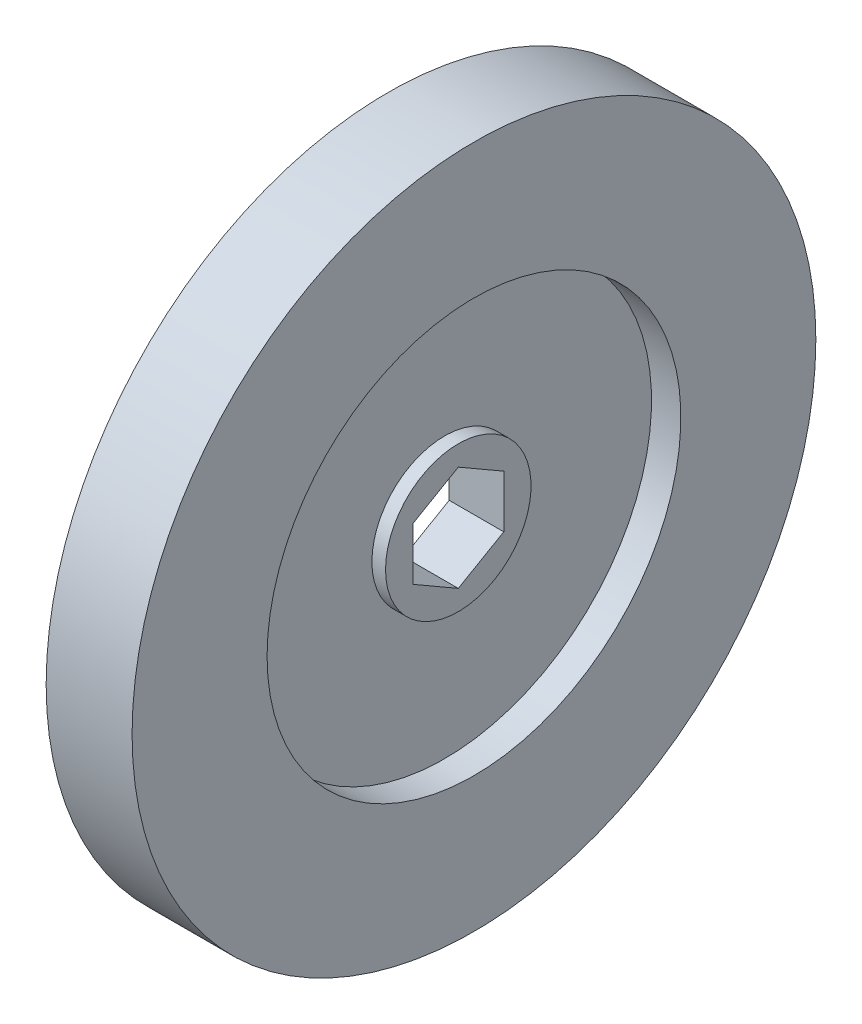
ISO-10303-21;
HEADER;
FILE_DESCRIPTION(('STEP AP214'),'2;1');
FILE_NAME('part.step','',(''),(''),'','','');
FILE_SCHEMA(('AUTOMOTIVE_DESIGN { 1 0 10303 214 1 1 1 1 }'));
ENDSEC;
DATA;
#1=APPLICATION_CONTEXT('core data for automotive mechanical design processes');
#2=APPLICATION_PROTOCOL_DEFINITION('international standard','automotive_design',2000,#1);
#3=PRODUCT_CONTEXT('',#1,'mechanical');
#4=PRODUCT('Part','Part','',(#3));
#5=PRODUCT_RELATED_PRODUCT_CATEGORY('part','',(#4));
#6=PRODUCT_DEFINITION_FORMATION('','',#4);
#7=PRODUCT_DEFINITION_CONTEXT('part definition',#1,'design');
#8=PRODUCT_DEFINITION('design','',#6,#7);
#9=PRODUCT_DEFINITION_SHAPE('','',#8);
#10=(LENGTH_UNIT() NAMED_UNIT(*) SI_UNIT(.MILLI.,.METRE.));
#11=(NAMED_UNIT(*) PLANE_ANGLE_UNIT() SI_UNIT($,.RADIAN.));
#12=(NAMED_UNIT(*) SI_UNIT($,.STERADIAN.) SOLID_ANGLE_UNIT());
#13=UNCERTAINTY_MEASURE_WITH_UNIT(LENGTH_MEASURE(1.E-05),#10,'distance_accuracy_value','');
#14=(GEOMETRIC_REPRESENTATION_CONTEXT(3) GLOBAL_UNCERTAINTY_ASSIGNED_CONTEXT((#13)) GLOBAL_UNIT_ASSIGNED_CONTEXT((#10,
#11,#12)) REPRESENTATION_CONTEXT('',''));
#15=CARTESIAN_POINT('',(0.,0.,0.));
#16=DIRECTION('',(0.,0.,1.));
#17=DIRECTION('',(1.,0.,0.));
#18=AXIS2_PLACEMENT_3D('',#15,#16,#17);
#19=CARTESIAN_POINT('',(6.,47.7464829275686,0.));
#20=DIRECTION('',(-1.,0.,0.));
#21=DIRECTION('',(0.,0.,1.));
#22=AXIS2_PLACEMENT_3D('',#19,#20,#21);
#23=PLANE('',#22);
#24=CARTESIAN_POINT('',(6.,0.,0.));
#25=DIRECTION('',(-1.,0.,0.));
#26=DIRECTION('',(0.,0.,1.));
#27=AXIS2_PLACEMENT_3D('',#24,#25,#26);
#28=CIRCLE('',#27,47.7464829275686);
#29=CARTESIAN_POINT('',(6.,0.,47.7464829275686));
#30=VERTEX_POINT('',#29);
#31=EDGE_CURVE('E118',#30,#30,#28,.T.);
#32=ORIENTED_EDGE('',*,*,#31,.F.);
#33=EDGE_LOOP('',(#32));
#34=FACE_BOUND('',#33,.T.);
#35=CARTESIAN_POINT('',(6.,0.,0.));
#36=DIRECTION('',(-1.,0.,0.));
#37=DIRECTION('',(0.,0.,1.));
#38=AXIS2_PLACEMENT_3D('',#35,#36,#37);
#39=CIRCLE('',#38,28.8925);
#40=CARTESIAN_POINT('',(6.,0.,28.8925));
#41=VERTEX_POINT('',#40);
#42=EDGE_CURVE('E151',#41,#41,#39,.T.);
#43=ORIENTED_EDGE('',*,*,#42,.T.);
#44=EDGE_LOOP('',(#43));
#45=FACE_BOUND('',#44,.T.);
#46=ADVANCED_FACE('F33',(#34,#45),#23,.F.);
#47=CARTESIAN_POINT('',(-12.5660346603092,0.,0.));
#48=DIRECTION('',(-1.,0.,0.));
#49=DIRECTION('',(0.,0.,1.));
#50=AXIS2_PLACEMENT_3D('',#47,#48,#49);
#51=CYLINDRICAL_SURFACE('',#50,28.8925);
#52=ORIENTED_EDGE('',*,*,#42,.F.);
#53=EDGE_LOOP('',(#52));
#54=FACE_BOUND('',#53,.T.);
#55=CARTESIAN_POINT('',(1.905,0.,0.));
#56=DIRECTION('',(-1.,0.,0.));
#57=DIRECTION('',(0.,0.,1.));
#58=AXIS2_PLACEMENT_3D('',#55,#56,#57);
#59=CIRCLE('',#58,28.8925);
#60=CARTESIAN_POINT('',(1.905,0.,28.8925));
#61=VERTEX_POINT('',#60);
#62=EDGE_CURVE('E148',#61,#61,#59,.T.);
#63=ORIENTED_EDGE('',*,*,#62,.T.);
#64=EDGE_LOOP('',(#63));
#65=FACE_BOUND('',#64,.T.);
#66=ADVANCED_FACE('F190',(#54,#65),#51,.F.);
#67=CARTESIAN_POINT('',(1.905,28.8925,0.));
#68=DIRECTION('',(-1.,0.,0.));
#69=DIRECTION('',(0.,0.,1.));
#70=AXIS2_PLACEMENT_3D('',#67,#68,#69);
#71=PLANE('',#70);
#72=ORIENTED_EDGE('',*,*,#62,.F.);
#73=EDGE_LOOP('',(#72));
#74=FACE_BOUND('',#73,.T.);
#75=CARTESIAN_POINT('',(1.905,0.,0.));
#76=DIRECTION('',(-1.,0.,0.));
#77=DIRECTION('',(0.,0.,1.));
#78=AXIS2_PLACEMENT_3D('',#75,#76,#77);
#79=CIRCLE('',#78,10.16);
#80=CARTESIAN_POINT('',(1.905,0.,10.16));
#81=VERTEX_POINT('',#80);
#82=EDGE_CURVE('E145',#81,#81,#79,.T.);
#83=ORIENTED_EDGE('',*,*,#82,.T.);
#84=EDGE_LOOP('',(#83));
#85=FACE_BOUND('',#84,.T.);
#86=ADVANCED_FACE('F195',(#74,#85),#71,.F.);
#87=CARTESIAN_POINT('',(-12.5660346603092,0.,0.));
#88=DIRECTION('',(-1.,0.,0.));
#89=DIRECTION('',(0.,0.,1.));
#90=AXIS2_PLACEMENT_3D('',#87,#88,#89);
#91=CYLINDRICAL_SURFACE('',#90,10.16);
#92=ORIENTED_EDGE('',*,*,#82,.F.);
#93=EDGE_LOOP('',(#92));
#94=FACE_BOUND('',#93,.T.);
#95=CARTESIAN_POINT('',(3.81,0.,0.));
#96=DIRECTION('',(-1.,0.,0.));
#97=DIRECTION('',(0.,0.,1.));
#98=AXIS2_PLACEMENT_3D('',#95,#96,#97);
#99=CIRCLE('',#98,10.16);
#100=CARTESIAN_POINT('',(3.81,0.,10.16));
#101=VERTEX_POINT('',#100);
#102=EDGE_CURVE('E142',#101,#101,#99,.T.);
#103=ORIENTED_EDGE('',*,*,#102,.T.);
#104=EDGE_LOOP('',(#103));
#105=FACE_BOUND('',#104,.T.);
#106=ADVANCED_FACE('F205',(#94,#105),#91,.T.);
#107=CARTESIAN_POINT('',(3.81,10.16,0.));
#108=DIRECTION('',(-1.,0.,0.));
#109=DIRECTION('',(0.,0.,1.));
#110=AXIS2_PLACEMENT_3D('',#107,#108,#109);
#111=PLANE('',#110);
#112=DIRECTION('',(0.,-0.5,0.866025403784439));
#113=VECTOR('',#112,1.);
#114=CARTESIAN_POINT('',(3.81,7.33234841870825,0.));
#115=LINE('',#114,#113);
#116=CARTESIAN_POINT('',(3.81,7.33234841870825,0.));
#117=VERTEX_POINT('',#116);
#118=CARTESIAN_POINT('',(3.81,3.66617420935413,6.35));
#119=VERTEX_POINT('',#118);
#120=EDGE_CURVE('E97',#117,#119,#115,.T.);
#121=ORIENTED_EDGE('',*,*,#120,.F.);
#122=DIRECTION('',(0.,0.5,0.866025403784439));
#123=VECTOR('',#122,1.);
#124=CARTESIAN_POINT('',(3.81,3.66617420935412,-6.35));
#125=LINE('',#124,#123);
#126=CARTESIAN_POINT('',(3.81,3.66617420935412,-6.35));
#127=VERTEX_POINT('',#126);
#128=EDGE_CURVE('E47',#127,#117,#125,.T.);
#129=ORIENTED_EDGE('',*,*,#128,.F.);
#130=DIRECTION('',(0.,1.,0.));
#131=VECTOR('',#130,1.);
#132=CARTESIAN_POINT('',(3.81,-3.66617420935413,-6.35));
#133=LINE('',#132,#131);
#134=CARTESIAN_POINT('',(3.81,-3.66617420935413,-6.35));
#135=VERTEX_POINT('',#134);
#136=EDGE_CURVE('E113',#135,#127,#133,.T.);
#137=ORIENTED_EDGE('',*,*,#136,.F.);
#138=DIRECTION('',(0.,0.5,-0.866025403784439));
#139=VECTOR('',#138,1.);
#140=CARTESIAN_POINT('',(3.81,-7.33234841870825,0.));
#141=LINE('',#140,#139);
#142=CARTESIAN_POINT('',(3.81,-7.33234841870825,0.));
#143=VERTEX_POINT('',#142);
#144=EDGE_CURVE('E107',#143,#135,#141,.T.);
#145=ORIENTED_EDGE('',*,*,#144,.F.);
#146=DIRECTION('',(0.,-0.5,-0.866025403784439));
#147=VECTOR('',#146,1.);
#148=CARTESIAN_POINT('',(3.81,-3.66617420935413,6.35));
#149=LINE('',#148,#147);
#150=CARTESIAN_POINT('',(3.81,-3.66617420935413,6.35));
#151=VERTEX_POINT('',#150);
#152=EDGE_CURVE('E105',#151,#143,#149,.T.);
#153=ORIENTED_EDGE('',*,*,#152,.F.);
#154=DIRECTION('',(0.,-1.,0.));
#155=VECTOR('',#154,1.);
#156=CARTESIAN_POINT('',(3.81,3.66617420935413,6.35));
#157=LINE('',#156,#155);
#158=EDGE_CURVE('E88',#119,#151,#157,.T.);
#159=ORIENTED_EDGE('',*,*,#158,.F.);
#160=EDGE_LOOP('',(#121,#129,#137,#145,#153,#159));
#161=FACE_BOUND('',#160,.T.);
#162=ORIENTED_EDGE('',*,*,#102,.F.);
#163=EDGE_LOOP('',(#162));
#164=FACE_BOUND('',#163,.T.);
#165=ADVANCED_FACE('F101',(#161,#164),#111,.F.);
#166=CARTESIAN_POINT('',(-3.81,10.16,0.));
#167=DIRECTION('',(1.,0.,0.));
#168=DIRECTION('',(0.,0.,-1.));
#169=AXIS2_PLACEMENT_3D('',#166,#167,#168);
#170=PLANE('',#169);
#171=DIRECTION('',(0.,1.,0.));
#172=VECTOR('',#171,1.);
#173=CARTESIAN_POINT('',(-3.81,10.16,-6.35));
#174=LINE('',#173,#172);
#175=CARTESIAN_POINT('',(-3.81,-3.66617420935413,-6.35));
#176=VERTEX_POINT('',#175);
#177=CARTESIAN_POINT('',(-3.81,3.66617420935412,-6.35));
#178=VERTEX_POINT('',#177);
#179=EDGE_CURVE('E40',#176,#178,#174,.T.);
#180=ORIENTED_EDGE('',*,*,#179,.T.);
#181=DIRECTION('',(0.,0.5,0.866025403784439));
#182=VECTOR('',#181,1.);
#183=CARTESIAN_POINT('',(-3.81,8.03926131403118,1.22440905122495));
#184=LINE('',#183,#182);
#185=CARTESIAN_POINT('',(-3.81,7.33234841870825,0.));
#186=VERTEX_POINT('',#185);
#187=EDGE_CURVE('E11',#178,#186,#184,.T.);
#188=ORIENTED_EDGE('',*,*,#187,.T.);
#189=DIRECTION('',(0.,-0.5,0.866025403784439));
#190=VECTOR('',#189,1.);
#191=CARTESIAN_POINT('',(-3.81,8.03926131403118,-1.22440905122495));
#192=LINE('',#191,#190);
#193=CARTESIAN_POINT('',(-3.81,3.66617420935413,6.35));
#194=VERTEX_POINT('',#193);
#195=EDGE_CURVE('E154',#186,#194,#192,.T.);
#196=ORIENTED_EDGE('',*,*,#195,.T.);
#197=DIRECTION('',(0.,-1.,0.));
#198=VECTOR('',#197,1.);
#199=CARTESIAN_POINT('',(-3.81,10.16,6.35));
#200=LINE('',#199,#198);
#201=CARTESIAN_POINT('',(-3.81,-3.66617420935413,6.35));
#202=VERTEX_POINT('',#201);
#203=EDGE_CURVE('E91',#194,#202,#200,.T.);
#204=ORIENTED_EDGE('',*,*,#203,.T.);
#205=DIRECTION('',(0.,-0.5,-0.866025403784439));
#206=VECTOR('',#205,1.);
#207=CARTESIAN_POINT('',(-3.81,-2.95926131403119,7.57440905122495));
#208=LINE('',#207,#206);
#209=CARTESIAN_POINT('',(-3.81,-7.33234841870825,0.));
#210=VERTEX_POINT('',#209);
#211=EDGE_CURVE('E157',#202,#210,#208,.T.);
#212=ORIENTED_EDGE('',*,*,#211,.T.);
#213=DIRECTION('',(0.,0.5,-0.866025403784439));
#214=VECTOR('',#213,1.);
#215=CARTESIAN_POINT('',(-3.81,-2.95926131403119,-7.57440905122495));
#216=LINE('',#215,#214);
#217=EDGE_CURVE('E160',#210,#176,#216,.T.);
#218=ORIENTED_EDGE('',*,*,#217,.T.);
#219=EDGE_LOOP('',(#180,#188,#196,#204,#212,#218));
#220=FACE_BOUND('',#219,.T.);
#221=CARTESIAN_POINT('',(-3.81,0.,0.));
#222=DIRECTION('',(-1.,0.,0.));
#223=DIRECTION('',(0.,0.,1.));
#224=AXIS2_PLACEMENT_3D('',#221,#222,#223);
#225=CIRCLE('',#224,10.16);
#226=CARTESIAN_POINT('',(-3.81,0.,10.16));
#227=VERTEX_POINT('',#226);
#228=EDGE_CURVE('E139',#227,#227,#225,.T.);
#229=ORIENTED_EDGE('',*,*,#228,.T.);
#230=EDGE_LOOP('',(#229));
#231=FACE_BOUND('',#230,.T.);
#232=ADVANCED_FACE('F164',(#220,#231),#170,.F.);
#233=CARTESIAN_POINT('',(-12.5660346603092,0.,0.));
#234=DIRECTION('',(-1.,0.,0.));
#235=DIRECTION('',(0.,0.,1.));
#236=AXIS2_PLACEMENT_3D('',#233,#234,#235);
#237=CYLINDRICAL_SURFACE('',#236,10.16);
#238=ORIENTED_EDGE('',*,*,#228,.F.);
#239=EDGE_LOOP('',(#238));
#240=FACE_BOUND('',#239,.T.);
#241=CARTESIAN_POINT('',(-1.905,0.,0.));
#242=DIRECTION('',(-1.,0.,0.));
#243=DIRECTION('',(0.,0.,1.));
#244=AXIS2_PLACEMENT_3D('',#241,#242,#243);
#245=CIRCLE('',#244,10.16);
#246=CARTESIAN_POINT('',(-1.905,0.,10.16));
#247=VERTEX_POINT('',#246);
#248=EDGE_CURVE('E136',#247,#247,#245,.T.);
#249=ORIENTED_EDGE('',*,*,#248,.T.);
#250=EDGE_LOOP('',(#249));
#251=FACE_BOUND('',#250,.T.);
#252=ADVANCED_FACE('F218',(#240,#251),#237,.T.);
#253=CARTESIAN_POINT('',(-1.905,28.8925,0.));
#254=DIRECTION('',(1.,0.,0.));
#255=DIRECTION('',(0.,0.,-1.));
#256=AXIS2_PLACEMENT_3D('',#253,#254,#255);
#257=PLANE('',#256);
#258=ORIENTED_EDGE('',*,*,#248,.F.);
#259=EDGE_LOOP('',(#258));
#260=FACE_BOUND('',#259,.T.);
#261=CARTESIAN_POINT('',(-1.905,0.,0.));
#262=DIRECTION('',(-1.,0.,0.));
#263=DIRECTION('',(0.,0.,1.));
#264=AXIS2_PLACEMENT_3D('',#261,#262,#263);
#265=CIRCLE('',#264,28.8925);
#266=CARTESIAN_POINT('',(-1.905,0.,28.8925));
#267=VERTEX_POINT('',#266);
#268=EDGE_CURVE('E133',#267,#267,#265,.T.);
#269=ORIENTED_EDGE('',*,*,#268,.T.);
#270=EDGE_LOOP('',(#269));
#271=FACE_BOUND('',#270,.T.);
#272=ADVANCED_FACE('F223',(#260,#271),#257,.F.);
#273=CARTESIAN_POINT('',(-12.5660346603092,0.,0.));
#274=DIRECTION('',(-1.,0.,0.));
#275=DIRECTION('',(0.,0.,1.));
#276=AXIS2_PLACEMENT_3D('',#273,#274,#275);
#277=CYLINDRICAL_SURFACE('',#276,28.8925);
#278=ORIENTED_EDGE('',*,*,#268,.F.);
#279=EDGE_LOOP('',(#278));
#280=FACE_BOUND('',#279,.T.);
#281=CARTESIAN_POINT('',(-6.,0.,0.));
#282=DIRECTION('',(-1.,0.,0.));
#283=DIRECTION('',(0.,0.,1.));
#284=AXIS2_PLACEMENT_3D('',#281,#282,#283);
#285=CIRCLE('',#284,28.8925);
#286=CARTESIAN_POINT('',(-6.,0.,28.8925));
#287=VERTEX_POINT('',#286);
#288=EDGE_CURVE('E130',#287,#287,#285,.T.);
#289=ORIENTED_EDGE('',*,*,#288,.T.);
#290=EDGE_LOOP('',(#289));
#291=FACE_BOUND('',#290,.T.);
#292=ADVANCED_FACE('F227',(#280,#291),#277,.F.);
#293=CARTESIAN_POINT('',(-6.,47.7464829275686,0.));
#294=DIRECTION('',(1.,0.,0.));
#295=DIRECTION('',(0.,0.,-1.));
#296=AXIS2_PLACEMENT_3D('',#293,#294,#295);
#297=PLANE('',#296);
#298=ORIENTED_EDGE('',*,*,#288,.F.);
#299=EDGE_LOOP('',(#298));
#300=FACE_BOUND('',#299,.T.);
#301=CARTESIAN_POINT('',(-6.,0.,0.));
#302=DIRECTION('',(-1.,0.,0.));
#303=DIRECTION('',(0.,0.,1.));
#304=AXIS2_PLACEMENT_3D('',#301,#302,#303);
#305=CIRCLE('',#304,47.7464829275686);
#306=CARTESIAN_POINT('',(-6.,0.,47.7464829275686));
#307=VERTEX_POINT('',#306);
#308=EDGE_CURVE('E127',#307,#307,#305,.T.);
#309=ORIENTED_EDGE('',*,*,#308,.T.);
#310=EDGE_LOOP('',(#309));
#311=FACE_BOUND('',#310,.T.);
#312=ADVANCED_FACE('F185',(#300,#311),#297,.F.);
#313=CARTESIAN_POINT('',(-12.5660346603092,0.,0.));
#314=DIRECTION('',(-1.,0.,0.));
#315=DIRECTION('',(0.,0.,1.));
#316=AXIS2_PLACEMENT_3D('',#313,#314,#315);
#317=CYLINDRICAL_SURFACE('',#316,47.7464829275686);
#318=ORIENTED_EDGE('',*,*,#308,.F.);
#319=EDGE_LOOP('',(#318));
#320=FACE_BOUND('',#319,.T.);
#321=ORIENTED_EDGE('',*,*,#31,.T.);
#322=EDGE_LOOP('',(#321));
#323=FACE_BOUND('',#322,.T.);
#324=ADVANCED_FACE('F178',(#320,#323),#317,.T.);
#325=CARTESIAN_POINT('',(-6.,3.66617420935412,-6.35));
#326=DIRECTION('',(0.,0.866025403784439,-0.5));
#327=DIRECTION('',(0.,0.5,0.866025403784439));
#328=AXIS2_PLACEMENT_3D('',#325,#326,#327);
#329=PLANE('',#328);
#330=DIRECTION('',(1.,0.,0.));
#331=VECTOR('',#330,1.);
#332=CARTESIAN_POINT('',(-6.,3.66617420935412,-6.35));
#333=LINE('',#332,#331);
#334=EDGE_CURVE('E116',#178,#127,#333,.T.);
#335=ORIENTED_EDGE('',*,*,#334,.T.);
#336=ORIENTED_EDGE('',*,*,#128,.T.);
#337=DIRECTION('',(1.,0.,0.));
#338=VECTOR('',#337,1.);
#339=CARTESIAN_POINT('',(-6.,7.33234841870825,0.));
#340=LINE('',#339,#338);
#341=EDGE_CURVE('E94',#186,#117,#340,.T.);
#342=ORIENTED_EDGE('',*,*,#341,.F.);
#343=ORIENTED_EDGE('',*,*,#187,.F.);
#344=EDGE_LOOP('',(#335,#336,#342,#343));
#345=FACE_BOUND('',#344,.T.);
#346=ADVANCED_FACE('F176',(#345),#329,.F.);
#347=CARTESIAN_POINT('',(-6.,-3.66617420935413,-6.35));
#348=DIRECTION('',(0.,0.,-1.));
#349=DIRECTION('',(0.,1.,0.));
#350=AXIS2_PLACEMENT_3D('',#347,#348,#349);
#351=PLANE('',#350);
#352=DIRECTION('',(1.,0.,0.));
#353=VECTOR('',#352,1.);
#354=CARTESIAN_POINT('',(-6.,-3.66617420935413,-6.35));
#355=LINE('',#354,#353);
#356=EDGE_CURVE('E119',#176,#135,#355,.T.);
#357=ORIENTED_EDGE('',*,*,#356,.T.);
#358=ORIENTED_EDGE('',*,*,#136,.T.);
#359=ORIENTED_EDGE('',*,*,#334,.F.);
#360=ORIENTED_EDGE('',*,*,#179,.F.);
#361=EDGE_LOOP('',(#357,#358,#359,#360));
#362=FACE_BOUND('',#361,.T.);
#363=ADVANCED_FACE('F169',(#362),#351,.F.);
#364=CARTESIAN_POINT('',(-6.,-7.33234841870825,0.));
#365=DIRECTION('',(0.,-0.866025403784439,-0.5));
#366=DIRECTION('',(0.,0.5,-0.866025403784439));
#367=AXIS2_PLACEMENT_3D('',#364,#365,#366);
#368=PLANE('',#367);
#369=DIRECTION('',(1.,0.,0.));
#370=VECTOR('',#369,1.);
#371=CARTESIAN_POINT('',(-6.,-7.33234841870825,0.));
#372=LINE('',#371,#370);
#373=EDGE_CURVE('E121',#210,#143,#372,.T.);
#374=ORIENTED_EDGE('',*,*,#373,.T.);
#375=ORIENTED_EDGE('',*,*,#144,.T.);
#376=ORIENTED_EDGE('',*,*,#356,.F.);
#377=ORIENTED_EDGE('',*,*,#217,.F.);
#378=EDGE_LOOP('',(#374,#375,#376,#377));
#379=FACE_BOUND('',#378,.T.);
#380=ADVANCED_FACE('F171',(#379),#368,.F.);
#381=CARTESIAN_POINT('',(-6.,-3.66617420935413,6.35));
#382=DIRECTION('',(0.,-0.866025403784439,0.5));
#383=DIRECTION('',(0.,-0.5,-0.866025403784439));
#384=AXIS2_PLACEMENT_3D('',#381,#382,#383);
#385=PLANE('',#384);
#386=DIRECTION('',(1.,0.,0.));
#387=VECTOR('',#386,1.);
#388=CARTESIAN_POINT('',(-6.,-3.66617420935413,6.35));
#389=LINE('',#388,#387);
#390=EDGE_CURVE('E93',#202,#151,#389,.T.);
#391=ORIENTED_EDGE('',*,*,#390,.T.);
#392=ORIENTED_EDGE('',*,*,#152,.T.);
#393=ORIENTED_EDGE('',*,*,#373,.F.);
#394=ORIENTED_EDGE('',*,*,#211,.F.);
#395=EDGE_LOOP('',(#391,#392,#393,#394));
#396=FACE_BOUND('',#395,.T.);
#397=ADVANCED_FACE('F175',(#396),#385,.F.);
#398=CARTESIAN_POINT('',(-6.,3.66617420935413,6.35));
#399=DIRECTION('',(0.,0.,1.));
#400=DIRECTION('',(0.,-1.,0.));
#401=AXIS2_PLACEMENT_3D('',#398,#399,#400);
#402=PLANE('',#401);
#403=DIRECTION('',(1.,0.,0.));
#404=VECTOR('',#403,1.);
#405=CARTESIAN_POINT('',(-6.,3.66617420935413,6.35));
#406=LINE('',#405,#404);
#407=EDGE_CURVE('E55',#194,#119,#406,.T.);
#408=ORIENTED_EDGE('',*,*,#407,.T.);
#409=ORIENTED_EDGE('',*,*,#158,.T.);
#410=ORIENTED_EDGE('',*,*,#390,.F.);
#411=ORIENTED_EDGE('',*,*,#203,.F.);
#412=EDGE_LOOP('',(#408,#409,#410,#411));
#413=FACE_BOUND('',#412,.T.);
#414=ADVANCED_FACE('F85',(#413),#402,.F.);
#415=CARTESIAN_POINT('',(-6.,7.33234841870825,0.));
#416=DIRECTION('',(0.,0.866025403784439,0.5));
#417=DIRECTION('',(0.,-0.5,0.866025403784439));
#418=AXIS2_PLACEMENT_3D('',#415,#416,#417);
#419=PLANE('',#418);
#420=ORIENTED_EDGE('',*,*,#341,.T.);
#421=ORIENTED_EDGE('',*,*,#120,.T.);
#422=ORIENTED_EDGE('',*,*,#407,.F.);
#423=ORIENTED_EDGE('',*,*,#195,.F.);
#424=EDGE_LOOP('',(#420,#421,#422,#423));
#425=FACE_BOUND('',#424,.T.);
#426=ADVANCED_FACE('F98',(#425),#419,.F.);
#427=CLOSED_SHELL('',(#46,#66,#86,#106,#165,#232,#252,#272,#292,#312,#324,#346,#363,#380,#397,
#414,#426));
#428=MANIFOLD_SOLID_BREP('B2',#427);
#429=ADVANCED_BREP_SHAPE_REPRESENTATION('',(#18,#428),#14);
#430=SHAPE_DEFINITION_REPRESENTATION(#9,#429);
ENDSEC;
END-ISO-10303-21;
